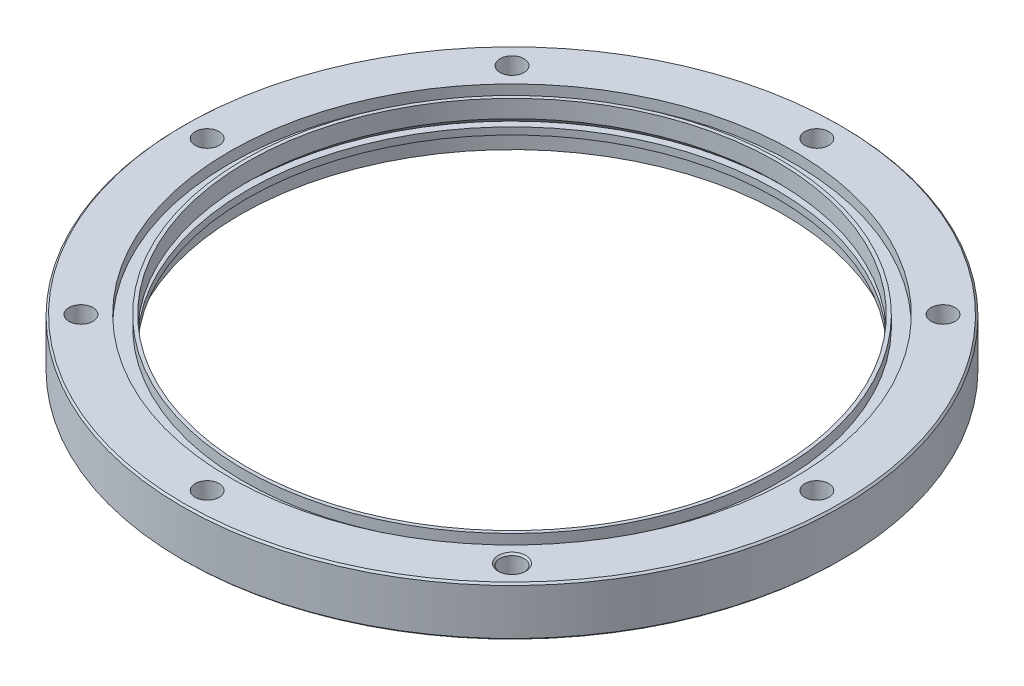
ISO-10303-21;
HEADER;
FILE_DESCRIPTION(('STEP AP214'),'2;1');
FILE_NAME('part.step','',(''),(''),'','','');
FILE_SCHEMA(('AUTOMOTIVE_DESIGN { 1 0 10303 214 1 1 1 1 }'));
ENDSEC;
DATA;
#1=APPLICATION_CONTEXT('core data for automotive mechanical design processes');
#2=APPLICATION_PROTOCOL_DEFINITION('international standard','automotive_design',2000,#1);
#3=PRODUCT_CONTEXT('',#1,'mechanical');
#4=PRODUCT('Part','Part','',(#3));
#5=PRODUCT_RELATED_PRODUCT_CATEGORY('part','',(#4));
#6=PRODUCT_DEFINITION_FORMATION('','',#4);
#7=PRODUCT_DEFINITION_CONTEXT('part definition',#1,'design');
#8=PRODUCT_DEFINITION('design','',#6,#7);
#9=PRODUCT_DEFINITION_SHAPE('','',#8);
#10=(LENGTH_UNIT() NAMED_UNIT(*) SI_UNIT(.MILLI.,.METRE.));
#11=(NAMED_UNIT(*) PLANE_ANGLE_UNIT() SI_UNIT($,.RADIAN.));
#12=(NAMED_UNIT(*) SI_UNIT($,.STERADIAN.) SOLID_ANGLE_UNIT());
#13=UNCERTAINTY_MEASURE_WITH_UNIT(LENGTH_MEASURE(1.E-05),#10,'distance_accuracy_value','');
#14=(GEOMETRIC_REPRESENTATION_CONTEXT(3) GLOBAL_UNCERTAINTY_ASSIGNED_CONTEXT((#13)) GLOBAL_UNIT_ASSIGNED_CONTEXT((#10,
#11,#12)) REPRESENTATION_CONTEXT('',''));
#15=CARTESIAN_POINT('',(0.,0.,0.));
#16=DIRECTION('',(0.,0.,1.));
#17=DIRECTION('',(1.,0.,0.));
#18=AXIS2_PLACEMENT_3D('',#15,#16,#17);
#19=CARTESIAN_POINT('',(61.05867055546,-2.17,61.05867055546));
#20=DIRECTION('',(0.,1.,0.));
#21=DIRECTION('',(1.,0.,0.));
#22=AXIS2_PLACEMENT_3D('',#19,#20,#21);
#23=CYLINDRICAL_SURFACE('',#22,3.4);
#24=CARTESIAN_POINT('',(61.05867055546,0.,61.05867055546));
#25=DIRECTION('',(0.,1.,0.));
#26=DIRECTION('',(1.,0.,0.));
#27=AXIS2_PLACEMENT_3D('',#24,#25,#26);
#28=CIRCLE('',#27,3.4);
#29=CARTESIAN_POINT('',(57.65867055546,0.,61.05867055546));
#30=VERTEX_POINT('',#29);
#31=EDGE_CURVE('E262',#30,#30,#28,.T.);
#32=ORIENTED_EDGE('',*,*,#31,.F.);
#33=DIRECTION('',(0.,1.,0.));
#34=VECTOR('',#33,1.);
#35=CARTESIAN_POINT('',(57.65867055546,-2.17,61.05867055546));
#36=LINE('',#35,#34);
#37=CARTESIAN_POINT('',(57.65867055546,13.5000055779522,61.05867055546));
#38=VERTEX_POINT('',#37);
#39=EDGE_CURVE('E11',#30,#38,#36,.T.);
#40=ORIENTED_EDGE('',*,*,#39,.T.);
#41=CARTESIAN_POINT('',(61.05867055546,13.5000055779522,61.05867055546));
#42=DIRECTION('',(0.,-1.,0.));
#43=DIRECTION('',(1.,0.,0.));
#44=AXIS2_PLACEMENT_3D('',#41,#42,#43);
#45=CIRCLE('',#44,3.4);
#46=CARTESIAN_POINT('',(61.05867055546,13.5000055779522,64.45867055546));
#47=VERTEX_POINT('',#46);
#48=EDGE_CURVE('E28',#47,#38,#45,.T.);
#49=ORIENTED_EDGE('',*,*,#48,.F.);
#50=CARTESIAN_POINT('',(61.05867055546,13.5000055779522,61.05867055546));
#51=DIRECTION('',(0.,-1.,0.));
#52=DIRECTION('',(1.,0.,0.));
#53=AXIS2_PLACEMENT_3D('',#50,#51,#52);
#54=CIRCLE('',#53,3.4);
#55=EDGE_CURVE('E253',#38,#47,#54,.T.);
#56=ORIENTED_EDGE('',*,*,#55,.F.);
#57=ORIENTED_EDGE('',*,*,#39,.F.);
#58=EDGE_LOOP('',(#32,#40,#49,#56,#57));
#59=FACE_BOUND('',#58,.T.);
#60=ADVANCED_FACE('F17',(#59),#23,.F.);
#61=CARTESIAN_POINT('',(61.05867055546,13.75001481056,61.05867055546));
#62=DIRECTION('',(0.,1.,0.));
#63=DIRECTION('',(0.,0.,-1.));
#64=AXIS2_PLACEMENT_3D('',#61,#62,#63);
#65=CONICAL_SURFACE('',#64,3.65000882245,0.785397343111375);
#66=ORIENTED_EDGE('',*,*,#55,.T.);
#67=DIRECTION('',(0.,0.707107361216155,0.707106201156465));
#68=VECTOR('',#67,1.);
#69=CARTESIAN_POINT('',(61.05867055546,13.75001481056,64.70867937791));
#70=LINE('',#69,#68);
#71=CARTESIAN_POINT('',(61.05867055546,14.,64.9586641572316));
#72=VERTEX_POINT('',#71);
#73=EDGE_CURVE('E21',#47,#72,#70,.T.);
#74=ORIENTED_EDGE('',*,*,#73,.T.);
#75=CARTESIAN_POINT('',(61.05867055546,14.,61.05867055546));
#76=DIRECTION('',(0.,-1.,0.));
#77=DIRECTION('',(0.,0.,-1.));
#78=AXIS2_PLACEMENT_3D('',#75,#76,#77);
#79=CIRCLE('',#78,3.8999936017716);
#80=EDGE_CURVE('E267',#72,#72,#79,.T.);
#81=ORIENTED_EDGE('',*,*,#80,.F.);
#82=ORIENTED_EDGE('',*,*,#73,.F.);
#83=ORIENTED_EDGE('',*,*,#48,.T.);
#84=EDGE_LOOP('',(#66,#74,#81,#82,#83));
#85=FACE_BOUND('',#84,.T.);
#86=ADVANCED_FACE('F502',(#85),#65,.F.);
#87=CARTESIAN_POINT('',(-1.074324415538E-12,0.2500039208835,0.));
#88=DIRECTION('',(0.,1.,0.));
#89=DIRECTION('',(0.,0.,-1.));
#90=AXIS2_PLACEMENT_3D('',#87,#88,#89);
#91=CONICAL_SURFACE('',#90,93.0999964622,0.785398123340049);
#92=CARTESIAN_POINT('',(0.,0.5000068626309,0.));
#93=DIRECTION('',(0.,1.,0.));
#94=DIRECTION('',(-1.,0.,0.));
#95=AXIS2_PLACEMENT_3D('',#92,#93,#94);
#96=CIRCLE('',#95,93.35);
#97=CARTESIAN_POINT('',(-1.06289233770568E-12,0.500007170672198,93.3499996919597));
#98=VERTEX_POINT('',#97);
#99=CARTESIAN_POINT('',(-93.35,0.5000068626309,0.));
#100=VERTEX_POINT('',#99);
#101=EDGE_CURVE('E289',#98,#100,#96,.T.);
#102=ORIENTED_EDGE('',*,*,#101,.F.);
#103=DIRECTION('',(0.,-0.707106809511407,-0.707106752861687));
#104=VECTOR('',#103,1.);
#105=CARTESIAN_POINT('',(-1.06292295427119E-12,0.2500039208835,93.0999964622));
#106=LINE('',#105,#104);
#107=CARTESIAN_POINT('',(-1.06295357088016E-12,3.16247234267986E-07,92.8499928775927));
#108=VERTEX_POINT('',#107);
#109=EDGE_CURVE('E257',#98,#108,#106,.T.);
#110=ORIENTED_EDGE('',*,*,#109,.T.);
#111=CARTESIAN_POINT('',(-1.074339723338E-12,3.162499666587E-07,0.));
#112=DIRECTION('',(0.,1.,0.));
#113=DIRECTION('',(1.,0.,0.));
#114=AXIS2_PLACEMENT_3D('',#111,#112,#113);
#115=CIRCLE('',#114,92.84999287759);
#116=EDGE_CURVE('E352',#108,#108,#115,.T.);
#117=ORIENTED_EDGE('',*,*,#116,.T.);
#118=ORIENTED_EDGE('',*,*,#109,.F.);
#119=CARTESIAN_POINT('',(0.,0.5000068626309,0.));
#120=DIRECTION('',(0.,1.,0.));
#121=DIRECTION('',(-1.,0.,0.));
#122=AXIS2_PLACEMENT_3D('',#119,#120,#121);
#123=CIRCLE('',#122,93.35);
#124=EDGE_CURVE('E282',#100,#98,#123,.T.);
#125=ORIENTED_EDGE('',*,*,#124,.F.);
#126=EDGE_LOOP('',(#102,#110,#117,#118,#125));
#127=FACE_BOUND('',#126,.T.);
#128=ADVANCED_FACE('F415',(#127),#91,.T.);
#129=CARTESIAN_POINT('',(0.,-0.7,0.));
#130=DIRECTION('',(0.,1.,0.));
#131=DIRECTION('',(1.,0.,0.));
#132=AXIS2_PLACEMENT_3D('',#129,#130,#131);
#133=CYLINDRICAL_SURFACE('',#132,93.35);
#134=CARTESIAN_POINT('',(0.,13.49999158874,0.));
#135=DIRECTION('',(0.,1.,0.));
#136=DIRECTION('',(1.,0.,0.));
#137=AXIS2_PLACEMENT_3D('',#134,#135,#136);
#138=CIRCLE('',#137,93.35);
#139=CARTESIAN_POINT('',(-93.35,13.49999158874,0.));
#140=VERTEX_POINT('',#139);
#141=CARTESIAN_POINT('',(-1.01899787811415E-12,13.4999911405108,93.3499995517716));
#142=VERTEX_POINT('',#141);
#143=EDGE_CURVE('E206',#140,#142,#138,.T.);
#144=ORIENTED_EDGE('',*,*,#143,.F.);
#145=DIRECTION('',(0.,-1.,0.));
#146=VECTOR('',#145,1.);
#147=CARTESIAN_POINT('',(-93.35,-0.7,0.));
#148=LINE('',#147,#146);
#149=EDGE_CURVE('E278',#140,#100,#148,.T.);
#150=ORIENTED_EDGE('',*,*,#149,.T.);
#151=ORIENTED_EDGE('',*,*,#124,.T.);
#152=ORIENTED_EDGE('',*,*,#101,.T.);
#153=ORIENTED_EDGE('',*,*,#149,.F.);
#154=CARTESIAN_POINT('',(0.,13.49999158874,0.));
#155=DIRECTION('',(0.,1.,0.));
#156=DIRECTION('',(1.,0.,0.));
#157=AXIS2_PLACEMENT_3D('',#154,#155,#156);
#158=CIRCLE('',#157,93.35);
#159=EDGE_CURVE('E283',#142,#140,#158,.T.);
#160=ORIENTED_EDGE('',*,*,#159,.F.);
#161=EDGE_LOOP('',(#144,#150,#151,#152,#153,#160));
#162=FACE_BOUND('',#161,.T.);
#163=ADVANCED_FACE('F410',(#162),#133,.T.);
#164=CARTESIAN_POINT('',(-1.007565800299E-12,13.74999510331,-3.819167204711E-13));
#165=DIRECTION('',(0.,-1.,0.));
#166=DIRECTION('',(0.,0.,-1.));
#167=AXIS2_PLACEMENT_3D('',#164,#165,#166);
#168=CONICAL_SURFACE('',#167,93.0999956139,0.785398113543689);
#169=ORIENTED_EDGE('',*,*,#143,.T.);
#170=DIRECTION('',(0.,0.707106816438478,-0.707106745934615));
#171=VECTOR('',#170,1.);
#172=CARTESIAN_POINT('',(-1.01896726146192E-12,13.74999510331,93.0999956138996));
#173=LINE('',#172,#171);
#174=CARTESIAN_POINT('',(-1.01893664475139E-12,13.9999995421987,92.8499911999383));
#175=VERTEX_POINT('',#174);
#176=EDGE_CURVE('E309',#142,#175,#173,.T.);
#177=ORIENTED_EDGE('',*,*,#176,.T.);
#178=CARTESIAN_POINT('',(-1.007550492447E-12,13.9999995422,-3.819167204711E-13));
#179=DIRECTION('',(0.,1.,0.));
#180=DIRECTION('',(1.,0.,0.));
#181=AXIS2_PLACEMENT_3D('',#178,#179,#180);
#182=CIRCLE('',#181,92.84999119994);
#183=EDGE_CURVE('E246',#175,#175,#182,.T.);
#184=ORIENTED_EDGE('',*,*,#183,.F.);
#185=ORIENTED_EDGE('',*,*,#176,.F.);
#186=ORIENTED_EDGE('',*,*,#159,.T.);
#187=EDGE_LOOP('',(#169,#177,#184,#185,#186));
#188=FACE_BOUND('',#187,.T.);
#189=ADVANCED_FACE('F408',(#188),#168,.T.);
#190=CARTESIAN_POINT('',(61.05867055546,-2.17,-61.05867055546));
#191=DIRECTION('',(0.,1.,0.));
#192=DIRECTION('',(1.,0.,0.));
#193=AXIS2_PLACEMENT_3D('',#190,#191,#192);
#194=CYLINDRICAL_SURFACE('',#193,3.4);
#195=CARTESIAN_POINT('',(61.05867055546,0.,-61.05867055546));
#196=DIRECTION('',(0.,1.,0.));
#197=DIRECTION('',(1.,0.,0.));
#198=AXIS2_PLACEMENT_3D('',#195,#196,#197);
#199=CIRCLE('',#198,3.4);
#200=CARTESIAN_POINT('',(57.65867055546,0.,-61.05867055546));
#201=VERTEX_POINT('',#200);
#202=EDGE_CURVE('E202',#201,#201,#199,.T.);
#203=ORIENTED_EDGE('',*,*,#202,.F.);
#204=DIRECTION('',(0.,1.,0.));
#205=VECTOR('',#204,1.);
#206=CARTESIAN_POINT('',(57.65867055546,-2.17,-61.05867055546));
#207=LINE('',#206,#205);
#208=CARTESIAN_POINT('',(57.65867055546,14.,-61.05867055546));
#209=VERTEX_POINT('',#208);
#210=EDGE_CURVE('E199',#201,#209,#207,.T.);
#211=ORIENTED_EDGE('',*,*,#210,.T.);
#212=CARTESIAN_POINT('',(61.05867055546,14.,-61.05867055546));
#213=DIRECTION('',(0.,1.,0.));
#214=DIRECTION('',(1.,0.,0.));
#215=AXIS2_PLACEMENT_3D('',#212,#213,#214);
#216=CIRCLE('',#215,3.4);
#217=EDGE_CURVE('E204',#209,#209,#216,.T.);
#218=ORIENTED_EDGE('',*,*,#217,.T.);
#219=ORIENTED_EDGE('',*,*,#210,.F.);
#220=EDGE_LOOP('',(#203,#211,#218,#219));
#221=FACE_BOUND('',#220,.T.);
#222=ADVANCED_FACE('F201',(#221),#194,.F.);
#223=CARTESIAN_POINT('',(0.,-2.17,-86.35));
#224=DIRECTION('',(0.,1.,0.));
#225=DIRECTION('',(1.,0.,0.));
#226=AXIS2_PLACEMENT_3D('',#223,#224,#225);
#227=CYLINDRICAL_SURFACE('',#226,3.4);
#228=CARTESIAN_POINT('',(0.,0.,-86.35));
#229=DIRECTION('',(0.,1.,0.));
#230=DIRECTION('',(1.,0.,0.));
#231=AXIS2_PLACEMENT_3D('',#228,#229,#230);
#232=CIRCLE('',#231,3.4);
#233=CARTESIAN_POINT('',(-3.4,0.,-86.35));
#234=VERTEX_POINT('',#233);
#235=EDGE_CURVE('E212',#234,#234,#232,.T.);
#236=ORIENTED_EDGE('',*,*,#235,.F.);
#237=DIRECTION('',(0.,1.,0.));
#238=VECTOR('',#237,1.);
#239=CARTESIAN_POINT('',(-3.4,-2.17,-86.35));
#240=LINE('',#239,#238);
#241=CARTESIAN_POINT('',(-3.4,14.,-86.35));
#242=VERTEX_POINT('',#241);
#243=EDGE_CURVE('E161',#234,#242,#240,.T.);
#244=ORIENTED_EDGE('',*,*,#243,.T.);
#245=CARTESIAN_POINT('',(0.,14.,-86.35));
#246=DIRECTION('',(0.,1.,0.));
#247=DIRECTION('',(1.,0.,0.));
#248=AXIS2_PLACEMENT_3D('',#245,#246,#247);
#249=CIRCLE('',#248,3.4);
#250=EDGE_CURVE('E270',#242,#242,#249,.T.);
#251=ORIENTED_EDGE('',*,*,#250,.T.);
#252=ORIENTED_EDGE('',*,*,#243,.F.);
#253=EDGE_LOOP('',(#236,#244,#251,#252));
#254=FACE_BOUND('',#253,.T.);
#255=ADVANCED_FACE('F560',(#254),#227,.F.);
#256=CARTESIAN_POINT('',(-61.05867055546,-2.17,-61.05867055546));
#257=DIRECTION('',(0.,1.,0.));
#258=DIRECTION('',(1.,0.,0.));
#259=AXIS2_PLACEMENT_3D('',#256,#257,#258);
#260=CYLINDRICAL_SURFACE('',#259,3.4);
#261=CARTESIAN_POINT('',(-61.05867055546,0.,-61.05867055546));
#262=DIRECTION('',(0.,1.,0.));
#263=DIRECTION('',(1.,0.,0.));
#264=AXIS2_PLACEMENT_3D('',#261,#262,#263);
#265=CIRCLE('',#264,3.4);
#266=CARTESIAN_POINT('',(-64.45867055546,0.,-61.05867055546));
#267=VERTEX_POINT('',#266);
#268=EDGE_CURVE('E223',#267,#267,#265,.T.);
#269=ORIENTED_EDGE('',*,*,#268,.F.);
#270=DIRECTION('',(0.,1.,0.));
#271=VECTOR('',#270,1.);
#272=CARTESIAN_POINT('',(-64.45867055546,-2.17,-61.05867055546));
#273=LINE('',#272,#271);
#274=CARTESIAN_POINT('',(-64.45867055546,14.,-61.05867055546));
#275=VERTEX_POINT('',#274);
#276=EDGE_CURVE('E150',#267,#275,#273,.T.);
#277=ORIENTED_EDGE('',*,*,#276,.T.);
#278=CARTESIAN_POINT('',(-61.05867055546,14.,-61.05867055546));
#279=DIRECTION('',(0.,1.,0.));
#280=DIRECTION('',(1.,0.,0.));
#281=AXIS2_PLACEMENT_3D('',#278,#279,#280);
#282=CIRCLE('',#281,3.4);
#283=EDGE_CURVE('E251',#275,#275,#282,.T.);
#284=ORIENTED_EDGE('',*,*,#283,.T.);
#285=ORIENTED_EDGE('',*,*,#276,.F.);
#286=EDGE_LOOP('',(#269,#277,#284,#285));
#287=FACE_BOUND('',#286,.T.);
#288=ADVANCED_FACE('F569',(#287),#260,.F.);
#289=CARTESIAN_POINT('',(-86.35,-2.17,0.));
#290=DIRECTION('',(0.,1.,0.));
#291=DIRECTION('',(1.,0.,0.));
#292=AXIS2_PLACEMENT_3D('',#289,#290,#291);
#293=CYLINDRICAL_SURFACE('',#292,3.4);
#294=CARTESIAN_POINT('',(-86.35,0.,0.));
#295=DIRECTION('',(0.,1.,0.));
#296=DIRECTION('',(1.,0.,0.));
#297=AXIS2_PLACEMENT_3D('',#294,#295,#296);
#298=CIRCLE('',#297,3.4);
#299=CARTESIAN_POINT('',(-89.75,0.,0.));
#300=VERTEX_POINT('',#299);
#301=EDGE_CURVE('E271',#300,#300,#298,.T.);
#302=ORIENTED_EDGE('',*,*,#301,.F.);
#303=DIRECTION('',(0.,1.,0.));
#304=VECTOR('',#303,1.);
#305=CARTESIAN_POINT('',(-89.75,-2.17,0.));
#306=LINE('',#305,#304);
#307=CARTESIAN_POINT('',(-89.75,14.,0.));
#308=VERTEX_POINT('',#307);
#309=EDGE_CURVE('E275',#300,#308,#306,.T.);
#310=ORIENTED_EDGE('',*,*,#309,.T.);
#311=CARTESIAN_POINT('',(-86.35,14.,0.));
#312=DIRECTION('',(0.,1.,0.));
#313=DIRECTION('',(1.,0.,0.));
#314=AXIS2_PLACEMENT_3D('',#311,#312,#313);
#315=CIRCLE('',#314,3.4);
#316=EDGE_CURVE('E247',#308,#308,#315,.T.);
#317=ORIENTED_EDGE('',*,*,#316,.T.);
#318=ORIENTED_EDGE('',*,*,#309,.F.);
#319=EDGE_LOOP('',(#302,#310,#317,#318));
#320=FACE_BOUND('',#319,.T.);
#321=ADVANCED_FACE('F577',(#320),#293,.F.);
#322=CARTESIAN_POINT('',(-61.05867055546,-2.17,61.05867055546));
#323=DIRECTION('',(0.,1.,0.));
#324=DIRECTION('',(1.,0.,0.));
#325=AXIS2_PLACEMENT_3D('',#322,#323,#324);
#326=CYLINDRICAL_SURFACE('',#325,3.4);
#327=CARTESIAN_POINT('',(-61.05867055546,0.,61.05867055546));
#328=DIRECTION('',(0.,1.,0.));
#329=DIRECTION('',(1.,0.,0.));
#330=AXIS2_PLACEMENT_3D('',#327,#328,#329);
#331=CIRCLE('',#330,3.4);
#332=CARTESIAN_POINT('',(-64.45867055546,0.,61.05867055546));
#333=VERTEX_POINT('',#332);
#334=EDGE_CURVE('E261',#333,#333,#331,.T.);
#335=ORIENTED_EDGE('',*,*,#334,.F.);
#336=DIRECTION('',(0.,1.,0.));
#337=VECTOR('',#336,1.);
#338=CARTESIAN_POINT('',(-64.45867055546,-2.17,61.05867055546));
#339=LINE('',#338,#337);
#340=CARTESIAN_POINT('',(-64.45867055546,14.,61.05867055546));
#341=VERTEX_POINT('',#340);
#342=EDGE_CURVE('E173',#333,#341,#339,.T.);
#343=ORIENTED_EDGE('',*,*,#342,.T.);
#344=CARTESIAN_POINT('',(-61.05867055546,14.,61.05867055546));
#345=DIRECTION('',(0.,1.,0.));
#346=DIRECTION('',(1.,0.,0.));
#347=AXIS2_PLACEMENT_3D('',#344,#345,#346);
#348=CIRCLE('',#347,3.4);
#349=EDGE_CURVE('E252',#341,#341,#348,.T.);
#350=ORIENTED_EDGE('',*,*,#349,.T.);
#351=ORIENTED_EDGE('',*,*,#342,.F.);
#352=EDGE_LOOP('',(#335,#343,#350,#351));
#353=FACE_BOUND('',#352,.T.);
#354=ADVANCED_FACE('F592',(#353),#326,.F.);
#355=CARTESIAN_POINT('',(0.,-2.17,86.35));
#356=DIRECTION('',(0.,1.,0.));
#357=DIRECTION('',(1.,0.,0.));
#358=AXIS2_PLACEMENT_3D('',#355,#356,#357);
#359=CYLINDRICAL_SURFACE('',#358,3.4);
#360=CARTESIAN_POINT('',(0.,0.,86.35));
#361=DIRECTION('',(0.,1.,0.));
#362=DIRECTION('',(1.,0.,0.));
#363=AXIS2_PLACEMENT_3D('',#360,#361,#362);
#364=CIRCLE('',#363,3.4);
#365=CARTESIAN_POINT('',(-3.4,0.,86.35));
#366=VERTEX_POINT('',#365);
#367=EDGE_CURVE('E258',#366,#366,#364,.T.);
#368=ORIENTED_EDGE('',*,*,#367,.F.);
#369=DIRECTION('',(0.,1.,0.));
#370=VECTOR('',#369,1.);
#371=CARTESIAN_POINT('',(-3.4,-2.17,86.35));
#372=LINE('',#371,#370);
#373=CARTESIAN_POINT('',(-3.4,14.,86.35));
#374=VERTEX_POINT('',#373);
#375=EDGE_CURVE('E184',#366,#374,#372,.T.);
#376=ORIENTED_EDGE('',*,*,#375,.T.);
#377=CARTESIAN_POINT('',(0.,14.,86.35));
#378=DIRECTION('',(0.,1.,0.));
#379=DIRECTION('',(1.,0.,0.));
#380=AXIS2_PLACEMENT_3D('',#377,#378,#379);
#381=CIRCLE('',#380,3.4);
#382=EDGE_CURVE('E245',#374,#374,#381,.T.);
#383=ORIENTED_EDGE('',*,*,#382,.T.);
#384=ORIENTED_EDGE('',*,*,#375,.F.);
#385=EDGE_LOOP('',(#368,#376,#383,#384));
#386=FACE_BOUND('',#385,.T.);
#387=ADVANCED_FACE('F479',(#386),#359,.F.);
#388=CARTESIAN_POINT('',(86.35,-2.17,0.));
#389=DIRECTION('',(0.,1.,0.));
#390=DIRECTION('',(1.,0.,0.));
#391=AXIS2_PLACEMENT_3D('',#388,#389,#390);
#392=CYLINDRICAL_SURFACE('',#391,3.4);
#393=CARTESIAN_POINT('',(86.35,0.,0.));
#394=DIRECTION('',(0.,1.,0.));
#395=DIRECTION('',(1.,0.,0.));
#396=AXIS2_PLACEMENT_3D('',#393,#394,#395);
#397=CIRCLE('',#396,3.4);
#398=CARTESIAN_POINT('',(82.95,0.,0.));
#399=VERTEX_POINT('',#398);
#400=EDGE_CURVE('E356',#399,#399,#397,.T.);
#401=ORIENTED_EDGE('',*,*,#400,.F.);
#402=DIRECTION('',(0.,1.,0.));
#403=VECTOR('',#402,1.);
#404=CARTESIAN_POINT('',(82.95,-2.17,0.));
#405=LINE('',#404,#403);
#406=CARTESIAN_POINT('',(82.95,14.,0.));
#407=VERTEX_POINT('',#406);
#408=EDGE_CURVE('E263',#399,#407,#405,.T.);
#409=ORIENTED_EDGE('',*,*,#408,.T.);
#410=CARTESIAN_POINT('',(86.35,14.,0.));
#411=DIRECTION('',(0.,1.,0.));
#412=DIRECTION('',(1.,0.,0.));
#413=AXIS2_PLACEMENT_3D('',#410,#411,#412);
#414=CIRCLE('',#413,3.4);
#415=EDGE_CURVE('E241',#407,#407,#414,.T.);
#416=ORIENTED_EDGE('',*,*,#415,.T.);
#417=ORIENTED_EDGE('',*,*,#408,.F.);
#418=EDGE_LOOP('',(#401,#409,#416,#417));
#419=FACE_BOUND('',#418,.T.);
#420=ADVANCED_FACE('F473',(#419),#392,.F.);
#421=CARTESIAN_POINT('',(0.,14.,0.));
#422=DIRECTION('',(0.,1.,0.));
#423=DIRECTION('',(1.,0.,0.));
#424=AXIS2_PLACEMENT_3D('',#421,#422,#423);
#425=PLANE('',#424);
#426=ORIENTED_EDGE('',*,*,#80,.T.);
#427=EDGE_LOOP('',(#426));
#428=FACE_BOUND('',#427,.T.);
#429=CARTESIAN_POINT('',(0.,14.,0.));
#430=DIRECTION('',(0.,1.,0.));
#431=DIRECTION('',(1.,0.,0.));
#432=AXIS2_PLACEMENT_3D('',#429,#430,#431);
#433=CIRCLE('',#432,80.);
#434=CARTESIAN_POINT('',(-80.,14.,0.));
#435=VERTEX_POINT('',#434);
#436=EDGE_CURVE('E361',#435,#435,#433,.T.);
#437=ORIENTED_EDGE('',*,*,#436,.F.);
#438=EDGE_LOOP('',(#437));
#439=FACE_BOUND('',#438,.T.);
#440=ORIENTED_EDGE('',*,*,#217,.F.);
#441=EDGE_LOOP('',(#440));
#442=FACE_BOUND('',#441,.T.);
#443=ORIENTED_EDGE('',*,*,#250,.F.);
#444=EDGE_LOOP('',(#443));
#445=FACE_BOUND('',#444,.T.);
#446=ORIENTED_EDGE('',*,*,#283,.F.);
#447=EDGE_LOOP('',(#446));
#448=FACE_BOUND('',#447,.T.);
#449=ORIENTED_EDGE('',*,*,#316,.F.);
#450=EDGE_LOOP('',(#449));
#451=FACE_BOUND('',#450,.T.);
#452=ORIENTED_EDGE('',*,*,#349,.F.);
#453=EDGE_LOOP('',(#452));
#454=FACE_BOUND('',#453,.T.);
#455=ORIENTED_EDGE('',*,*,#382,.F.);
#456=EDGE_LOOP('',(#455));
#457=FACE_BOUND('',#456,.T.);
#458=ORIENTED_EDGE('',*,*,#415,.F.);
#459=EDGE_LOOP('',(#458));
#460=FACE_BOUND('',#459,.T.);
#461=ORIENTED_EDGE('',*,*,#183,.T.);
#462=EDGE_LOOP('',(#461));
#463=FACE_BOUND('',#462,.T.);
#464=ADVANCED_FACE('F478',(#428,#439,#442,#445,#448,#451,#454,#457,#460,#463),#425,.T.);
#465=CARTESIAN_POINT('',(0.,-0.7,0.));
#466=DIRECTION('',(0.,1.,0.));
#467=DIRECTION('',(1.,0.,0.));
#468=AXIS2_PLACEMENT_3D('',#465,#466,#467);
#469=CYLINDRICAL_SURFACE('',#468,80.);
#470=CARTESIAN_POINT('',(0.,11.,0.));
#471=DIRECTION('',(0.,1.,0.));
#472=DIRECTION('',(1.,0.,0.));
#473=AXIS2_PLACEMENT_3D('',#470,#471,#472);
#474=CIRCLE('',#473,80.);
#475=CARTESIAN_POINT('',(-80.,11.,0.));
#476=VERTEX_POINT('',#475);
#477=EDGE_CURVE('E287',#476,#476,#474,.T.);
#478=ORIENTED_EDGE('',*,*,#477,.F.);
#479=DIRECTION('',(0.,1.,0.));
#480=VECTOR('',#479,1.);
#481=CARTESIAN_POINT('',(-80.,-0.7,0.));
#482=LINE('',#481,#480);
#483=EDGE_CURVE('E357',#476,#435,#482,.T.);
#484=ORIENTED_EDGE('',*,*,#483,.T.);
#485=ORIENTED_EDGE('',*,*,#436,.T.);
#486=ORIENTED_EDGE('',*,*,#483,.F.);
#487=EDGE_LOOP('',(#478,#484,#485,#486));
#488=FACE_BOUND('',#487,.T.);
#489=ADVANCED_FACE('F491',(#488),#469,.F.);
#490=CARTESIAN_POINT('',(0.,11.,0.));
#491=DIRECTION('',(0.,1.,0.));
#492=DIRECTION('',(1.,0.,0.));
#493=AXIS2_PLACEMENT_3D('',#490,#491,#492);
#494=PLANE('',#493);
#495=CARTESIAN_POINT('',(0.,11.,0.));
#496=DIRECTION('',(0.,1.,0.));
#497=DIRECTION('',(1.,0.,0.));
#498=AXIS2_PLACEMENT_3D('',#495,#496,#497);
#499=CIRCLE('',#498,76.);
#500=CARTESIAN_POINT('',(-76.,11.,0.));
#501=VERTEX_POINT('',#500);
#502=EDGE_CURVE('E284',#501,#501,#499,.T.);
#503=ORIENTED_EDGE('',*,*,#502,.F.);
#504=EDGE_LOOP('',(#503));
#505=FACE_BOUND('',#504,.T.);
#506=ORIENTED_EDGE('',*,*,#477,.T.);
#507=EDGE_LOOP('',(#506));
#508=FACE_BOUND('',#507,.T.);
#509=ADVANCED_FACE('F486',(#505,#508),#494,.T.);
#510=CARTESIAN_POINT('',(0.,-0.7,0.));
#511=DIRECTION('',(0.,1.,0.));
#512=DIRECTION('',(1.,0.,0.));
#513=AXIS2_PLACEMENT_3D('',#510,#511,#512);
#514=CYLINDRICAL_SURFACE('',#513,76.);
#515=CARTESIAN_POINT('',(0.,14.,0.));
#516=DIRECTION('',(0.,1.,0.));
#517=DIRECTION('',(1.,0.,0.));
#518=AXIS2_PLACEMENT_3D('',#515,#516,#517);
#519=CIRCLE('',#518,76.);
#520=CARTESIAN_POINT('',(-76.,14.,0.));
#521=VERTEX_POINT('',#520);
#522=EDGE_CURVE('E300',#521,#521,#519,.T.);
#523=ORIENTED_EDGE('',*,*,#522,.F.);
#524=DIRECTION('',(0.,-1.,0.));
#525=VECTOR('',#524,1.);
#526=CARTESIAN_POINT('',(-76.,-0.7,0.));
#527=LINE('',#526,#525);
#528=EDGE_CURVE('E288',#521,#501,#527,.T.);
#529=ORIENTED_EDGE('',*,*,#528,.T.);
#530=ORIENTED_EDGE('',*,*,#502,.T.);
#531=ORIENTED_EDGE('',*,*,#528,.F.);
#532=EDGE_LOOP('',(#523,#529,#530,#531));
#533=FACE_BOUND('',#532,.T.);
#534=ADVANCED_FACE('F329',(#533),#514,.T.);
#535=CARTESIAN_POINT('',(0.,14.,0.));
#536=DIRECTION('',(0.,1.,0.));
#537=DIRECTION('',(1.,0.,0.));
#538=AXIS2_PLACEMENT_3D('',#535,#536,#537);
#539=PLANE('',#538);
#540=CARTESIAN_POINT('',(0.,14.,0.));
#541=DIRECTION('',(0.,1.,0.));
#542=DIRECTION('',(1.,0.,0.));
#543=AXIS2_PLACEMENT_3D('',#540,#541,#542);
#544=CIRCLE('',#543,75.);
#545=CARTESIAN_POINT('',(-75.,14.,0.));
#546=VERTEX_POINT('',#545);
#547=EDGE_CURVE('E298',#546,#546,#544,.T.);
#548=ORIENTED_EDGE('',*,*,#547,.F.);
#549=EDGE_LOOP('',(#548));
#550=FACE_BOUND('',#549,.T.);
#551=ORIENTED_EDGE('',*,*,#522,.T.);
#552=EDGE_LOOP('',(#551));
#553=FACE_BOUND('',#552,.T.);
#554=ADVANCED_FACE('F326',(#550,#553),#539,.T.);
#555=CARTESIAN_POINT('',(0.,-0.7,0.));
#556=DIRECTION('',(0.,1.,0.));
#557=DIRECTION('',(1.,0.,0.));
#558=AXIS2_PLACEMENT_3D('',#555,#556,#557);
#559=CYLINDRICAL_SURFACE('',#558,75.);
#560=CARTESIAN_POINT('',(0.,9.,0.));
#561=DIRECTION('',(0.,1.,0.));
#562=DIRECTION('',(1.,0.,0.));
#563=AXIS2_PLACEMENT_3D('',#560,#561,#562);
#564=CIRCLE('',#563,75.);
#565=CARTESIAN_POINT('',(-75.,9.,0.));
#566=VERTEX_POINT('',#565);
#567=CARTESIAN_POINT('',(75.,9.,0.));
#568=VERTEX_POINT('',#567);
#569=EDGE_CURVE('E227',#566,#568,#564,.T.);
#570=ORIENTED_EDGE('',*,*,#569,.F.);
#571=DIRECTION('',(0.,1.,0.));
#572=VECTOR('',#571,1.);
#573=CARTESIAN_POINT('',(-75.,-0.7,0.));
#574=LINE('',#573,#572);
#575=EDGE_CURVE('E295',#566,#546,#574,.T.);
#576=ORIENTED_EDGE('',*,*,#575,.T.);
#577=ORIENTED_EDGE('',*,*,#547,.T.);
#578=ORIENTED_EDGE('',*,*,#575,.F.);
#579=CARTESIAN_POINT('',(0.,9.,0.));
#580=DIRECTION('',(0.,1.,0.));
#581=DIRECTION('',(1.,0.,0.));
#582=AXIS2_PLACEMENT_3D('',#579,#580,#581);
#583=CIRCLE('',#582,75.);
#584=EDGE_CURVE('E240',#568,#566,#583,.T.);
#585=ORIENTED_EDGE('',*,*,#584,.F.);
#586=EDGE_LOOP('',(#570,#576,#577,#578,#585));
#587=FACE_BOUND('',#586,.T.);
#588=ADVANCED_FACE('F324',(#587),#559,.F.);
#589=CARTESIAN_POINT('',(0.,8.,0.));
#590=DIRECTION('',(0.,-1.,0.));
#591=DIRECTION('',(-1.,0.,0.));
#592=AXIS2_PLACEMENT_3D('',#589,#590,#591);
#593=CONICAL_SURFACE('',#592,76.,0.785398163397448);
#594=ORIENTED_EDGE('',*,*,#569,.T.);
#595=DIRECTION('',(0.707106781186548,-0.707106781186548,0.));
#596=VECTOR('',#595,1.);
#597=CARTESIAN_POINT('',(76.,8.,0.));
#598=LINE('',#597,#596);
#599=CARTESIAN_POINT('',(77.,7.,0.));
#600=VERTEX_POINT('',#599);
#601=EDGE_CURVE('E231',#568,#600,#598,.T.);
#602=ORIENTED_EDGE('',*,*,#601,.T.);
#603=CARTESIAN_POINT('',(0.,7.,0.));
#604=DIRECTION('',(0.,1.,0.));
#605=DIRECTION('',(1.,0.,0.));
#606=AXIS2_PLACEMENT_3D('',#603,#604,#605);
#607=CIRCLE('',#606,77.);
#608=EDGE_CURVE('E232',#600,#600,#607,.T.);
#609=ORIENTED_EDGE('',*,*,#608,.F.);
#610=ORIENTED_EDGE('',*,*,#601,.F.);
#611=ORIENTED_EDGE('',*,*,#584,.T.);
#612=EDGE_LOOP('',(#594,#602,#609,#610,#611));
#613=FACE_BOUND('',#612,.T.);
#614=ADVANCED_FACE('F521',(#613),#593,.F.);
#615=CARTESIAN_POINT('',(0.,7.,0.));
#616=DIRECTION('',(0.,1.,0.));
#617=DIRECTION('',(1.,0.,0.));
#618=AXIS2_PLACEMENT_3D('',#615,#616,#617);
#619=PLANE('',#618);
#620=CARTESIAN_POINT('',(0.,7.,0.));
#621=DIRECTION('',(0.,1.,0.));
#622=DIRECTION('',(1.,0.,0.));
#623=AXIS2_PLACEMENT_3D('',#620,#621,#622);
#624=CIRCLE('',#623,75.);
#625=CARTESIAN_POINT('',(-75.,7.,0.));
#626=VERTEX_POINT('',#625);
#627=EDGE_CURVE('E233',#626,#626,#624,.T.);
#628=ORIENTED_EDGE('',*,*,#627,.F.);
#629=EDGE_LOOP('',(#628));
#630=FACE_BOUND('',#629,.T.);
#631=ORIENTED_EDGE('',*,*,#608,.T.);
#632=EDGE_LOOP('',(#631));
#633=FACE_BOUND('',#632,.T.);
#634=ADVANCED_FACE('F514',(#630,#633),#619,.T.);
#635=CARTESIAN_POINT('',(0.,-0.7,0.));
#636=DIRECTION('',(0.,1.,0.));
#637=DIRECTION('',(1.,0.,0.));
#638=AXIS2_PLACEMENT_3D('',#635,#636,#637);
#639=CYLINDRICAL_SURFACE('',#638,75.);
#640=CARTESIAN_POINT('',(0.,5.,0.));
#641=DIRECTION('',(0.,1.,0.));
#642=DIRECTION('',(1.,0.,0.));
#643=AXIS2_PLACEMENT_3D('',#640,#641,#642);
#644=CIRCLE('',#643,75.);
#645=CARTESIAN_POINT('',(-75.,5.,0.));
#646=VERTEX_POINT('',#645);
#647=EDGE_CURVE('E315',#646,#646,#644,.T.);
#648=ORIENTED_EDGE('',*,*,#647,.F.);
#649=DIRECTION('',(0.,1.,0.));
#650=VECTOR('',#649,1.);
#651=CARTESIAN_POINT('',(-75.,-0.7,0.));
#652=LINE('',#651,#650);
#653=EDGE_CURVE('E237',#646,#626,#652,.T.);
#654=ORIENTED_EDGE('',*,*,#653,.T.);
#655=ORIENTED_EDGE('',*,*,#627,.T.);
#656=ORIENTED_EDGE('',*,*,#653,.F.);
#657=EDGE_LOOP('',(#648,#654,#655,#656));
#658=FACE_BOUND('',#657,.T.);
#659=ADVANCED_FACE('F508',(#658),#639,.F.);
#660=CARTESIAN_POINT('',(0.,5.,0.));
#661=DIRECTION('',(0.,1.,0.));
#662=DIRECTION('',(1.,0.,0.));
#663=AXIS2_PLACEMENT_3D('',#660,#661,#662);
#664=PLANE('',#663);
#665=ORIENTED_EDGE('',*,*,#647,.T.);
#666=EDGE_LOOP('',(#665));
#667=FACE_BOUND('',#666,.T.);
#668=CARTESIAN_POINT('',(0.,5.,0.));
#669=DIRECTION('',(0.,1.,0.));
#670=DIRECTION('',(1.,0.,0.));
#671=AXIS2_PLACEMENT_3D('',#668,#669,#670);
#672=CIRCLE('',#671,77.);
#673=CARTESIAN_POINT('',(-77.,5.,0.));
#674=VERTEX_POINT('',#673);
#675=EDGE_CURVE('E313',#674,#674,#672,.T.);
#676=ORIENTED_EDGE('',*,*,#675,.F.);
#677=EDGE_LOOP('',(#676));
#678=FACE_BOUND('',#677,.T.);
#679=ADVANCED_FACE('F513',(#667,#678),#664,.F.);
#680=CARTESIAN_POINT('',(0.,-0.7,0.));
#681=DIRECTION('',(0.,1.,0.));
#682=DIRECTION('',(1.,0.,0.));
#683=AXIS2_PLACEMENT_3D('',#680,#681,#682);
#684=CYLINDRICAL_SURFACE('',#683,77.);
#685=CARTESIAN_POINT('',(0.,0.,0.));
#686=DIRECTION('',(0.,1.,0.));
#687=DIRECTION('',(1.,0.,0.));
#688=AXIS2_PLACEMENT_3D('',#685,#686,#687);
#689=CIRCLE('',#688,77.);
#690=CARTESIAN_POINT('',(-77.,0.,0.));
#691=VERTEX_POINT('',#690);
#692=EDGE_CURVE('E211',#691,#691,#689,.T.);
#693=ORIENTED_EDGE('',*,*,#692,.F.);
#694=DIRECTION('',(0.,1.,0.));
#695=VECTOR('',#694,1.);
#696=CARTESIAN_POINT('',(-77.,-0.7,0.));
#697=LINE('',#696,#695);
#698=EDGE_CURVE('E220',#691,#674,#697,.T.);
#699=ORIENTED_EDGE('',*,*,#698,.T.);
#700=ORIENTED_EDGE('',*,*,#675,.T.);
#701=ORIENTED_EDGE('',*,*,#698,.F.);
#702=EDGE_LOOP('',(#693,#699,#700,#701));
#703=FACE_BOUND('',#702,.T.);
#704=ADVANCED_FACE('F598',(#703),#684,.F.);
#705=CARTESIAN_POINT('',(0.,0.,0.));
#706=DIRECTION('',(0.,1.,0.));
#707=DIRECTION('',(1.,0.,0.));
#708=AXIS2_PLACEMENT_3D('',#705,#706,#707);
#709=PLANE('',#708);
#710=ORIENTED_EDGE('',*,*,#692,.T.);
#711=EDGE_LOOP('',(#710));
#712=FACE_BOUND('',#711,.T.);
#713=ORIENTED_EDGE('',*,*,#202,.T.);
#714=EDGE_LOOP('',(#713));
#715=FACE_BOUND('',#714,.T.);
#716=ORIENTED_EDGE('',*,*,#235,.T.);
#717=EDGE_LOOP('',(#716));
#718=FACE_BOUND('',#717,.T.);
#719=ORIENTED_EDGE('',*,*,#268,.T.);
#720=EDGE_LOOP('',(#719));
#721=FACE_BOUND('',#720,.T.);
#722=ORIENTED_EDGE('',*,*,#301,.T.);
#723=EDGE_LOOP('',(#722));
#724=FACE_BOUND('',#723,.T.);
#725=ORIENTED_EDGE('',*,*,#334,.T.);
#726=EDGE_LOOP('',(#725));
#727=FACE_BOUND('',#726,.T.);
#728=ORIENTED_EDGE('',*,*,#367,.T.);
#729=EDGE_LOOP('',(#728));
#730=FACE_BOUND('',#729,.T.);
#731=ORIENTED_EDGE('',*,*,#31,.T.);
#732=EDGE_LOOP('',(#731));
#733=FACE_BOUND('',#732,.T.);
#734=ORIENTED_EDGE('',*,*,#400,.T.);
#735=EDGE_LOOP('',(#734));
#736=FACE_BOUND('',#735,.T.);
#737=ORIENTED_EDGE('',*,*,#116,.F.);
#738=EDGE_LOOP('',(#737));
#739=FACE_BOUND('',#738,.T.);
#740=ADVANCED_FACE('F19',(#712,#715,#718,#721,#724,#727,#730,#733,#736,#739),#709,.F.);
#741=CLOSED_SHELL('',(#60,#86,#128,#163,#189,#222,#255,#288,#321,#354,#387,#420,#464,#489,#509,
#534,#554,#588,#614,#634,#659,#679,#704,#740));
#742=MANIFOLD_SOLID_BREP('B1',#741);
#743=ADVANCED_BREP_SHAPE_REPRESENTATION('',(#18,#742),#14);
#744=SHAPE_DEFINITION_REPRESENTATION(#9,#743);
ENDSEC;
END-ISO-10303-21;
